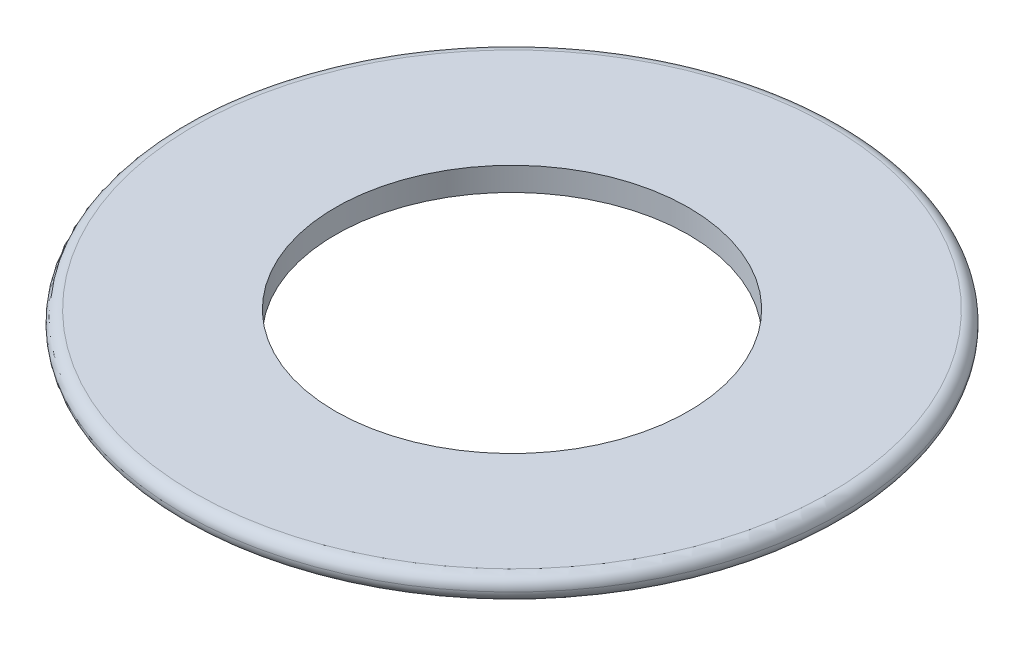
ISO-10303-21;
HEADER;
FILE_DESCRIPTION(('STEP AP214'),'2;1');
FILE_NAME('part.step','',(''),(''),'','','');
FILE_SCHEMA(('AUTOMOTIVE_DESIGN { 1 0 10303 214 1 1 1 1 }'));
ENDSEC;
DATA;
#1=APPLICATION_CONTEXT('core data for automotive mechanical design processes');
#2=APPLICATION_PROTOCOL_DEFINITION('international standard','automotive_design',2000,#1);
#3=PRODUCT_CONTEXT('',#1,'mechanical');
#4=PRODUCT('Part','Part','',(#3));
#5=PRODUCT_RELATED_PRODUCT_CATEGORY('part','',(#4));
#6=PRODUCT_DEFINITION_FORMATION('','',#4);
#7=PRODUCT_DEFINITION_CONTEXT('part definition',#1,'design');
#8=PRODUCT_DEFINITION('design','',#6,#7);
#9=PRODUCT_DEFINITION_SHAPE('','',#8);
#10=(LENGTH_UNIT() NAMED_UNIT(*) SI_UNIT(.MILLI.,.METRE.));
#11=(NAMED_UNIT(*) PLANE_ANGLE_UNIT() SI_UNIT($,.RADIAN.));
#12=(NAMED_UNIT(*) SI_UNIT($,.STERADIAN.) SOLID_ANGLE_UNIT());
#13=UNCERTAINTY_MEASURE_WITH_UNIT(LENGTH_MEASURE(1.E-05),#10,'distance_accuracy_value','');
#14=(GEOMETRIC_REPRESENTATION_CONTEXT(3) GLOBAL_UNCERTAINTY_ASSIGNED_CONTEXT((#13)) GLOBAL_UNIT_ASSIGNED_CONTEXT((#10,
#11,#12)) REPRESENTATION_CONTEXT('',''));
#15=CARTESIAN_POINT('',(0.,0.,0.));
#16=DIRECTION('',(0.,0.,1.));
#17=DIRECTION('',(1.,0.,0.));
#18=AXIS2_PLACEMENT_3D('',#15,#16,#17);
#19=CARTESIAN_POINT('',(0.,1.,0.));
#20=DIRECTION('',(0.,1.,0.));
#21=DIRECTION('',(0.,0.,1.));
#22=AXIS2_PLACEMENT_3D('',#19,#20,#21);
#23=PLANE('',#22);
#24=CARTESIAN_POINT('',(0.,1.,0.));
#25=DIRECTION('',(0.,1.,0.));
#26=DIRECTION('',(0.,0.,1.));
#27=AXIS2_PLACEMENT_3D('',#24,#25,#26);
#28=CIRCLE('',#27,13.5);
#29=CARTESIAN_POINT('',(0.,1.,13.5));
#30=VERTEX_POINT('',#29);
#31=EDGE_CURVE('E10',#30,#30,#28,.T.);
#32=ORIENTED_EDGE('',*,*,#31,.T.);
#33=EDGE_LOOP('',(#32));
#34=FACE_BOUND('',#33,.T.);
#35=CARTESIAN_POINT('',(0.,1.,0.));
#36=DIRECTION('',(0.,1.,0.));
#37=DIRECTION('',(0.,0.,1.));
#38=AXIS2_PLACEMENT_3D('',#35,#36,#37);
#39=CIRCLE('',#38,7.5);
#40=CARTESIAN_POINT('',(0.,1.,7.5));
#41=VERTEX_POINT('',#40);
#42=EDGE_CURVE('E44',#41,#41,#39,.T.);
#43=ORIENTED_EDGE('',*,*,#42,.F.);
#44=EDGE_LOOP('',(#43));
#45=FACE_BOUND('',#44,.T.);
#46=ADVANCED_FACE('F32',(#34,#45),#23,.T.);
#47=CARTESIAN_POINT('',(0.,0.,0.));
#48=DIRECTION('',(0.,1.,0.));
#49=DIRECTION('',(0.,0.,1.));
#50=AXIS2_PLACEMENT_3D('',#47,#48,#49);
#51=PLANE('',#50);
#52=CARTESIAN_POINT('',(0.,0.,0.));
#53=DIRECTION('',(0.,1.,0.));
#54=DIRECTION('',(0.,0.,1.));
#55=AXIS2_PLACEMENT_3D('',#52,#53,#54);
#56=CIRCLE('',#55,13.5);
#57=CARTESIAN_POINT('',(0.,0.,13.5));
#58=VERTEX_POINT('',#57);
#59=EDGE_CURVE('E40',#58,#58,#56,.F.);
#60=ORIENTED_EDGE('',*,*,#59,.T.);
#61=EDGE_LOOP('',(#60));
#62=FACE_BOUND('',#61,.T.);
#63=CARTESIAN_POINT('',(0.,0.,0.));
#64=DIRECTION('',(0.,1.,0.));
#65=DIRECTION('',(0.,0.,1.));
#66=AXIS2_PLACEMENT_3D('',#63,#64,#65);
#67=CIRCLE('',#66,7.5);
#68=CARTESIAN_POINT('',(0.,0.,7.5));
#69=VERTEX_POINT('',#68);
#70=EDGE_CURVE('E47',#69,#69,#67,.T.);
#71=ORIENTED_EDGE('',*,*,#70,.T.);
#72=EDGE_LOOP('',(#71));
#73=FACE_BOUND('',#72,.T.);
#74=ADVANCED_FACE('F57',(#62,#73),#51,.F.);
#75=CARTESIAN_POINT('',(0.,1.,0.));
#76=DIRECTION('',(0.,-1.,0.));
#77=DIRECTION('',(0.,0.,-1.));
#78=AXIS2_PLACEMENT_3D('',#75,#76,#77);
#79=CYLINDRICAL_SURFACE('',#78,7.5);
#80=ORIENTED_EDGE('',*,*,#42,.T.);
#81=EDGE_LOOP('',(#80));
#82=FACE_BOUND('',#81,.T.);
#83=ORIENTED_EDGE('',*,*,#70,.F.);
#84=EDGE_LOOP('',(#83));
#85=FACE_BOUND('',#84,.T.);
#86=ADVANCED_FACE('F53',(#82,#85),#79,.F.);
#87=CARTESIAN_POINT('',(0.,0.5,0.));
#88=DIRECTION('',(0.,1.,0.));
#89=DIRECTION('',(0.,0.,1.));
#90=AXIS2_PLACEMENT_3D('',#87,#88,#89);
#91=TOROIDAL_SURFACE('',#90,13.5,0.5);
#92=ORIENTED_EDGE('',*,*,#31,.F.);
#93=EDGE_LOOP('',(#92));
#94=FACE_BOUND('',#93,.T.);
#95=CARTESIAN_POINT('',(0.,0.5,0.));
#96=DIRECTION('',(0.,1.,0.));
#97=DIRECTION('',(0.,0.,1.));
#98=AXIS2_PLACEMENT_3D('',#95,#96,#97);
#99=CIRCLE('',#98,14.);
#100=CARTESIAN_POINT('',(0.,0.5,14.));
#101=VERTEX_POINT('',#100);
#102=EDGE_CURVE('E36',#101,#101,#99,.F.);
#103=ORIENTED_EDGE('',*,*,#102,.F.);
#104=EDGE_LOOP('',(#103));
#105=FACE_BOUND('',#104,.T.);
#106=ADVANCED_FACE('F34',(#94,#105),#91,.T.);
#107=CARTESIAN_POINT('',(0.,0.5,0.));
#108=DIRECTION('',(0.,1.,0.));
#109=DIRECTION('',(0.,0.,1.));
#110=AXIS2_PLACEMENT_3D('',#107,#108,#109);
#111=TOROIDAL_SURFACE('',#110,13.5,0.5);
#112=ORIENTED_EDGE('',*,*,#59,.F.);
#113=EDGE_LOOP('',(#112));
#114=FACE_BOUND('',#113,.T.);
#115=ORIENTED_EDGE('',*,*,#102,.T.);
#116=EDGE_LOOP('',(#115));
#117=FACE_BOUND('',#116,.T.);
#118=ADVANCED_FACE('F65',(#114,#117),#111,.T.);
#119=CLOSED_SHELL('',(#46,#74,#86,#106,#118));
#120=MANIFOLD_SOLID_BREP('B2',#119);
#121=ADVANCED_BREP_SHAPE_REPRESENTATION('',(#18,#120),#14);
#122=SHAPE_DEFINITION_REPRESENTATION(#9,#121);
ENDSEC;
END-ISO-10303-21;
